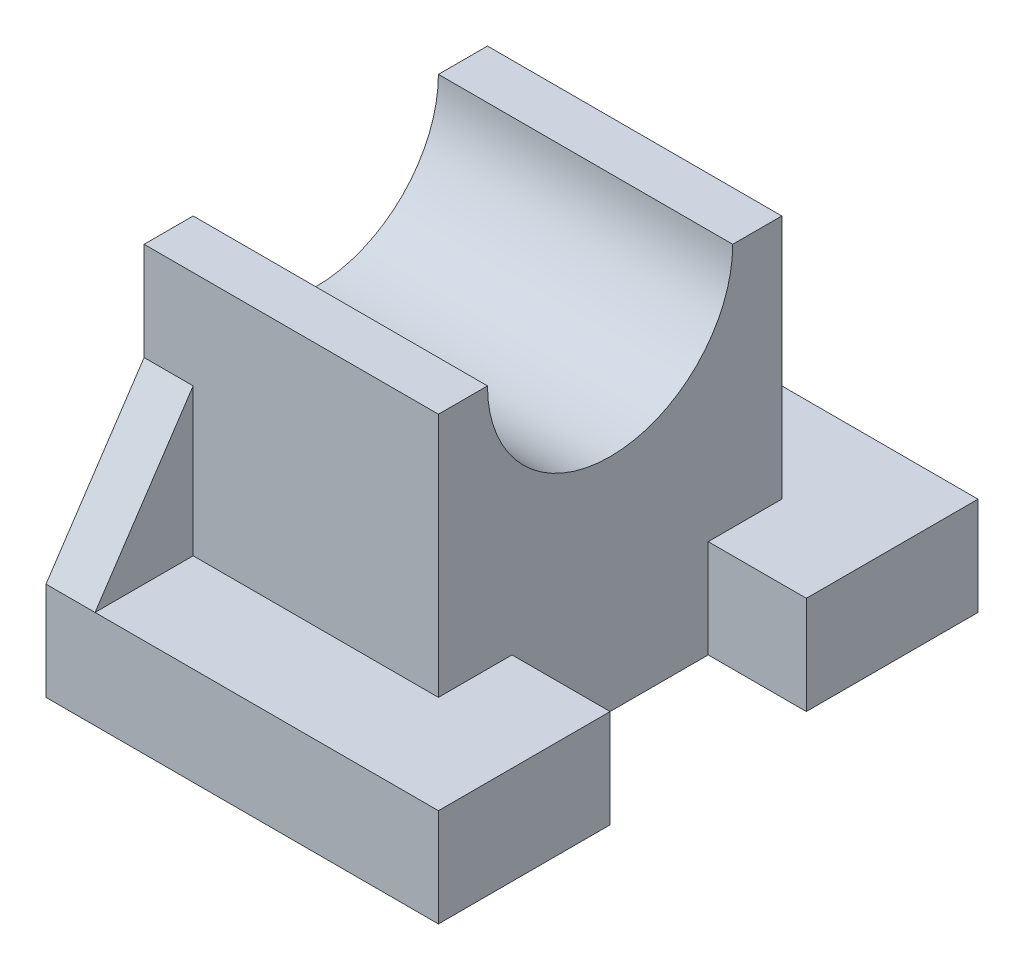
ISO-10303-21;
HEADER;
FILE_DESCRIPTION(('STEP AP214'),'2;1');
FILE_NAME('part.step','',(''),(''),'','','');
FILE_SCHEMA(('AUTOMOTIVE_DESIGN { 1 0 10303 214 1 1 1 1 }'));
ENDSEC;
DATA;
#1=APPLICATION_CONTEXT('core data for automotive mechanical design processes');
#2=APPLICATION_PROTOCOL_DEFINITION('international standard','automotive_design',2000,#1);
#3=PRODUCT_CONTEXT('',#1,'mechanical');
#4=PRODUCT('Part','Part','',(#3));
#5=PRODUCT_RELATED_PRODUCT_CATEGORY('part','',(#4));
#6=PRODUCT_DEFINITION_FORMATION('','',#4);
#7=PRODUCT_DEFINITION_CONTEXT('part definition',#1,'design');
#8=PRODUCT_DEFINITION('design','',#6,#7);
#9=PRODUCT_DEFINITION_SHAPE('','',#8);
#10=(LENGTH_UNIT() NAMED_UNIT(*) SI_UNIT(.MILLI.,.METRE.));
#11=(NAMED_UNIT(*) PLANE_ANGLE_UNIT() SI_UNIT($,.RADIAN.));
#12=(NAMED_UNIT(*) SI_UNIT($,.STERADIAN.) SOLID_ANGLE_UNIT());
#13=UNCERTAINTY_MEASURE_WITH_UNIT(LENGTH_MEASURE(1.E-05),#10,'distance_accuracy_value','');
#14=(GEOMETRIC_REPRESENTATION_CONTEXT(3) GLOBAL_UNCERTAINTY_ASSIGNED_CONTEXT((#13)) GLOBAL_UNIT_ASSIGNED_CONTEXT((#10,
#11,#12)) REPRESENTATION_CONTEXT('',''));
#15=CARTESIAN_POINT('',(0.,0.,0.));
#16=DIRECTION('',(0.,0.,1.));
#17=DIRECTION('',(1.,0.,0.));
#18=AXIS2_PLACEMENT_3D('',#15,#16,#17);
#19=CARTESIAN_POINT('',(0.,70.,0.));
#20=DIRECTION('',(0.,1.,0.));
#21=DIRECTION('',(0.,0.,1.));
#22=AXIS2_PLACEMENT_3D('',#19,#20,#21);
#23=PLANE('',#22);
#24=DIRECTION('',(1.,0.,0.));
#25=VECTOR('',#24,1.);
#26=CARTESIAN_POINT('',(-40.,70.,25.));
#27=LINE('',#26,#25);
#28=CARTESIAN_POINT('',(-40.,70.,25.));
#29=VERTEX_POINT('',#28);
#30=CARTESIAN_POINT('',(20.,70.,25.));
#31=VERTEX_POINT('',#30);
#32=EDGE_CURVE('E11',#29,#31,#27,.T.);
#33=ORIENTED_EDGE('',*,*,#32,.F.);
#34=DIRECTION('',(0.,0.,1.));
#35=VECTOR('',#34,1.);
#36=CARTESIAN_POINT('',(-40.,70.,-35.));
#37=LINE('',#36,#35);
#38=CARTESIAN_POINT('',(-40.,70.,35.));
#39=VERTEX_POINT('',#38);
#40=EDGE_CURVE('E171',#29,#39,#37,.T.);
#41=ORIENTED_EDGE('',*,*,#40,.T.);
#42=DIRECTION('',(1.,0.,0.));
#43=VECTOR('',#42,1.);
#44=CARTESIAN_POINT('',(-40.,70.,35.));
#45=LINE('',#44,#43);
#46=CARTESIAN_POINT('',(20.,70.,35.));
#47=VERTEX_POINT('',#46);
#48=EDGE_CURVE('E179',#39,#47,#45,.T.);
#49=ORIENTED_EDGE('',*,*,#48,.T.);
#50=DIRECTION('',(0.,0.,-1.));
#51=VECTOR('',#50,1.);
#52=CARTESIAN_POINT('',(20.,70.,-35.));
#53=LINE('',#52,#51);
#54=EDGE_CURVE('E305',#47,#31,#53,.T.);
#55=ORIENTED_EDGE('',*,*,#54,.T.);
#56=EDGE_LOOP('',(#33,#41,#49,#55));
#57=FACE_BOUND('',#56,.T.);
#58=ADVANCED_FACE('F39',(#57),#23,.T.);
#59=CARTESIAN_POINT('',(0.,20.,0.));
#60=DIRECTION('',(0.,-1.,0.));
#61=DIRECTION('',(0.,0.,-1.));
#62=AXIS2_PLACEMENT_3D('',#59,#60,#61);
#63=PLANE('',#62);
#64=DIRECTION('',(-1.,0.,0.));
#65=VECTOR('',#64,1.);
#66=CARTESIAN_POINT('',(0.,20.,-20.));
#67=LINE('',#66,#65);
#68=CARTESIAN_POINT('',(40.,20.,-20.));
#69=VERTEX_POINT('',#68);
#70=CARTESIAN_POINT('',(20.,20.,-20.));
#71=VERTEX_POINT('',#70);
#72=EDGE_CURVE('E295',#69,#71,#67,.T.);
#73=ORIENTED_EDGE('',*,*,#72,.F.);
#74=DIRECTION('',(0.,0.,-1.));
#75=VECTOR('',#74,1.);
#76=CARTESIAN_POINT('',(40.,20.,-55.));
#77=LINE('',#76,#75);
#78=CARTESIAN_POINT('',(40.,20.,-55.));
#79=VERTEX_POINT('',#78);
#80=EDGE_CURVE('E218',#69,#79,#77,.T.);
#81=ORIENTED_EDGE('',*,*,#80,.T.);
#82=DIRECTION('',(-1.,0.,0.));
#83=VECTOR('',#82,1.);
#84=CARTESIAN_POINT('',(40.,20.,-55.));
#85=LINE('',#84,#83);
#86=CARTESIAN_POINT('',(-30.,20.,-55.));
#87=VERTEX_POINT('',#86);
#88=EDGE_CURVE('E224',#79,#87,#85,.T.);
#89=ORIENTED_EDGE('',*,*,#88,.T.);
#90=DIRECTION('',(0.,0.,-1.));
#91=VECTOR('',#90,1.);
#92=CARTESIAN_POINT('',(-30.,20.,0.));
#93=LINE('',#92,#91);
#94=CARTESIAN_POINT('',(-30.,20.,-35.));
#95=VERTEX_POINT('',#94);
#96=EDGE_CURVE('E282',#95,#87,#93,.T.);
#97=ORIENTED_EDGE('',*,*,#96,.F.);
#98=DIRECTION('',(-1.,0.,0.));
#99=VECTOR('',#98,1.);
#100=CARTESIAN_POINT('',(0.,20.,-35.));
#101=LINE('',#100,#99);
#102=CARTESIAN_POINT('',(20.,20.,-35.));
#103=VERTEX_POINT('',#102);
#104=EDGE_CURVE('E205',#103,#95,#101,.T.);
#105=ORIENTED_EDGE('',*,*,#104,.F.);
#106=DIRECTION('',(0.,0.,-1.));
#107=VECTOR('',#106,1.);
#108=CARTESIAN_POINT('',(20.,20.,0.));
#109=LINE('',#108,#107);
#110=EDGE_CURVE('E209',#71,#103,#109,.T.);
#111=ORIENTED_EDGE('',*,*,#110,.F.);
#112=EDGE_LOOP('',(#73,#81,#89,#97,#105,#111));
#113=FACE_BOUND('',#112,.T.);
#114=ADVANCED_FACE('F372',(#113),#63,.F.);
#115=DIRECTION('',(1.,0.,0.));
#116=VECTOR('',#115,1.);
#117=CARTESIAN_POINT('',(0.,20.,20.));
#118=LINE('',#117,#116);
#119=CARTESIAN_POINT('',(20.,20.,20.));
#120=VERTEX_POINT('',#119);
#121=CARTESIAN_POINT('',(40.,20.,20.));
#122=VERTEX_POINT('',#121);
#123=EDGE_CURVE('E293',#120,#122,#118,.T.);
#124=ORIENTED_EDGE('',*,*,#123,.F.);
#125=CARTESIAN_POINT('',(20.,20.,35.));
#126=VERTEX_POINT('',#125);
#127=EDGE_CURVE('E210',#126,#120,#109,.T.);
#128=ORIENTED_EDGE('',*,*,#127,.F.);
#129=DIRECTION('',(1.,0.,0.));
#130=VECTOR('',#129,1.);
#131=CARTESIAN_POINT('',(0.,20.,35.));
#132=LINE('',#131,#130);
#133=CARTESIAN_POINT('',(-30.,20.,35.));
#134=VERTEX_POINT('',#133);
#135=EDGE_CURVE('E202',#134,#126,#132,.T.);
#136=ORIENTED_EDGE('',*,*,#135,.F.);
#137=CARTESIAN_POINT('',(-30.,20.,55.));
#138=VERTEX_POINT('',#137);
#139=EDGE_CURVE('E268',#138,#134,#93,.T.);
#140=ORIENTED_EDGE('',*,*,#139,.F.);
#141=DIRECTION('',(1.,0.,0.));
#142=VECTOR('',#141,1.);
#143=CARTESIAN_POINT('',(40.,20.,55.));
#144=LINE('',#143,#142);
#145=CARTESIAN_POINT('',(40.,20.,55.));
#146=VERTEX_POINT('',#145);
#147=EDGE_CURVE('E215',#138,#146,#144,.T.);
#148=ORIENTED_EDGE('',*,*,#147,.T.);
#149=EDGE_CURVE('E220',#146,#122,#77,.T.);
#150=ORIENTED_EDGE('',*,*,#149,.T.);
#151=EDGE_LOOP('',(#124,#128,#136,#140,#148,#150));
#152=FACE_BOUND('',#151,.T.);
#153=ADVANCED_FACE('F275',(#152),#63,.F.);
#154=CARTESIAN_POINT('',(40.,20.,-55.));
#155=DIRECTION('',(-1.,0.,0.));
#156=DIRECTION('',(0.,0.,1.));
#157=AXIS2_PLACEMENT_3D('',#154,#155,#156);
#158=PLANE('',#157);
#159=DIRECTION('',(0.,-1.,0.));
#160=VECTOR('',#159,1.);
#161=CARTESIAN_POINT('',(40.,70.,-20.));
#162=LINE('',#161,#160);
#163=CARTESIAN_POINT('',(40.,0.,-20.));
#164=VERTEX_POINT('',#163);
#165=EDGE_CURVE('E296',#69,#164,#162,.T.);
#166=ORIENTED_EDGE('',*,*,#165,.T.);
#167=DIRECTION('',(0.,0.,-1.));
#168=VECTOR('',#167,1.);
#169=CARTESIAN_POINT('',(40.,0.,-55.));
#170=LINE('',#169,#168);
#171=CARTESIAN_POINT('',(40.,0.,-55.));
#172=VERTEX_POINT('',#171);
#173=EDGE_CURVE('E234',#164,#172,#170,.T.);
#174=ORIENTED_EDGE('',*,*,#173,.T.);
#175=DIRECTION('',(0.,-1.,0.));
#176=VECTOR('',#175,1.);
#177=CARTESIAN_POINT('',(40.,20.,-55.));
#178=LINE('',#177,#176);
#179=EDGE_CURVE('E244',#79,#172,#178,.T.);
#180=ORIENTED_EDGE('',*,*,#179,.F.);
#181=ORIENTED_EDGE('',*,*,#80,.F.);
#182=EDGE_LOOP('',(#166,#174,#180,#181));
#183=FACE_BOUND('',#182,.T.);
#184=ADVANCED_FACE('F385',(#183),#158,.F.);
#185=DIRECTION('',(0.,-1.,0.));
#186=VECTOR('',#185,1.);
#187=CARTESIAN_POINT('',(40.,70.,20.));
#188=LINE('',#187,#186);
#189=CARTESIAN_POINT('',(40.,0.,20.));
#190=VERTEX_POINT('',#189);
#191=EDGE_CURVE('E62',#122,#190,#188,.T.);
#192=ORIENTED_EDGE('',*,*,#191,.F.);
#193=ORIENTED_EDGE('',*,*,#149,.F.);
#194=DIRECTION('',(0.,-1.,0.));
#195=VECTOR('',#194,1.);
#196=CARTESIAN_POINT('',(40.,20.,55.));
#197=LINE('',#196,#195);
#198=CARTESIAN_POINT('',(40.,0.,55.));
#199=VERTEX_POINT('',#198);
#200=EDGE_CURVE('E248',#146,#199,#197,.T.);
#201=ORIENTED_EDGE('',*,*,#200,.T.);
#202=EDGE_CURVE('E235',#199,#190,#170,.T.);
#203=ORIENTED_EDGE('',*,*,#202,.T.);
#204=EDGE_LOOP('',(#192,#193,#201,#203));
#205=FACE_BOUND('',#204,.T.);
#206=ADVANCED_FACE('F292',(#205),#158,.F.);
#207=CARTESIAN_POINT('',(0.,0.,0.));
#208=DIRECTION('',(0.,-1.,0.));
#209=DIRECTION('',(0.,0.,-1.));
#210=AXIS2_PLACEMENT_3D('',#207,#208,#209);
#211=PLANE('',#210);
#212=ORIENTED_EDGE('',*,*,#173,.F.);
#213=DIRECTION('',(-1.,0.,0.));
#214=VECTOR('',#213,1.);
#215=CARTESIAN_POINT('',(20.,0.,-20.));
#216=LINE('',#215,#214);
#217=CARTESIAN_POINT('',(20.,0.,-20.));
#218=VERTEX_POINT('',#217);
#219=EDGE_CURVE('E330',#164,#218,#216,.T.);
#220=ORIENTED_EDGE('',*,*,#219,.T.);
#221=DIRECTION('',(0.,0.,1.));
#222=VECTOR('',#221,1.);
#223=CARTESIAN_POINT('',(20.,0.,-20.));
#224=LINE('',#223,#222);
#225=CARTESIAN_POINT('',(20.,0.,20.));
#226=VERTEX_POINT('',#225);
#227=EDGE_CURVE('E334',#218,#226,#224,.T.);
#228=ORIENTED_EDGE('',*,*,#227,.T.);
#229=DIRECTION('',(1.,0.,0.));
#230=VECTOR('',#229,1.);
#231=CARTESIAN_POINT('',(20.,0.,20.));
#232=LINE('',#231,#230);
#233=EDGE_CURVE('E338',#226,#190,#232,.T.);
#234=ORIENTED_EDGE('',*,*,#233,.T.);
#235=ORIENTED_EDGE('',*,*,#202,.F.);
#236=DIRECTION('',(1.,0.,0.));
#237=VECTOR('',#236,1.);
#238=CARTESIAN_POINT('',(40.,0.,55.));
#239=LINE('',#238,#237);
#240=CARTESIAN_POINT('',(-40.,0.,55.));
#241=VERTEX_POINT('',#240);
#242=EDGE_CURVE('E231',#241,#199,#239,.T.);
#243=ORIENTED_EDGE('',*,*,#242,.F.);
#244=DIRECTION('',(0.,0.,1.));
#245=VECTOR('',#244,1.);
#246=CARTESIAN_POINT('',(-40.,0.,-55.));
#247=LINE('',#246,#245);
#248=CARTESIAN_POINT('',(-40.,0.,-55.));
#249=VERTEX_POINT('',#248);
#250=EDGE_CURVE('E214',#249,#241,#247,.T.);
#251=ORIENTED_EDGE('',*,*,#250,.F.);
#252=DIRECTION('',(-1.,0.,0.));
#253=VECTOR('',#252,1.);
#254=CARTESIAN_POINT('',(40.,0.,-55.));
#255=LINE('',#254,#253);
#256=EDGE_CURVE('E219',#172,#249,#255,.T.);
#257=ORIENTED_EDGE('',*,*,#256,.F.);
#258=EDGE_LOOP('',(#212,#220,#228,#234,#235,#243,#251,#257));
#259=FACE_BOUND('',#258,.T.);
#260=ADVANCED_FACE('F395',(#259),#211,.T.);
#261=CARTESIAN_POINT('',(-40.,70.,-35.));
#262=DIRECTION('',(0.,0.,1.));
#263=DIRECTION('',(1.,0.,0.));
#264=AXIS2_PLACEMENT_3D('',#261,#262,#263);
#265=PLANE('',#264);
#266=DIRECTION('',(0.,-1.,0.));
#267=VECTOR('',#266,1.);
#268=CARTESIAN_POINT('',(-30.,70.,-35.));
#269=LINE('',#268,#267);
#270=CARTESIAN_POINT('',(-30.,50.,-35.));
#271=VERTEX_POINT('',#270);
#272=EDGE_CURVE('E279',#271,#95,#269,.T.);
#273=ORIENTED_EDGE('',*,*,#272,.F.);
#274=DIRECTION('',(-1.,0.,0.));
#275=VECTOR('',#274,1.);
#276=CARTESIAN_POINT('',(-40.,50.,-35.));
#277=LINE('',#276,#275);
#278=CARTESIAN_POINT('',(-40.,50.,-35.));
#279=VERTEX_POINT('',#278);
#280=EDGE_CURVE('E280',#271,#279,#277,.T.);
#281=ORIENTED_EDGE('',*,*,#280,.T.);
#282=DIRECTION('',(0.,-1.,0.));
#283=VECTOR('',#282,1.);
#284=CARTESIAN_POINT('',(-40.,70.,-35.));
#285=LINE('',#284,#283);
#286=CARTESIAN_POINT('',(-40.,70.,-35.));
#287=VERTEX_POINT('',#286);
#288=EDGE_CURVE('E195',#287,#279,#285,.T.);
#289=ORIENTED_EDGE('',*,*,#288,.F.);
#290=DIRECTION('',(-1.,0.,0.));
#291=VECTOR('',#290,1.);
#292=CARTESIAN_POINT('',(-40.,70.,-35.));
#293=LINE('',#292,#291);
#294=CARTESIAN_POINT('',(20.,70.,-35.));
#295=VERTEX_POINT('',#294);
#296=EDGE_CURVE('E176',#295,#287,#293,.T.);
#297=ORIENTED_EDGE('',*,*,#296,.F.);
#298=DIRECTION('',(0.,-1.,0.));
#299=VECTOR('',#298,1.);
#300=CARTESIAN_POINT('',(20.,70.,-35.));
#301=LINE('',#300,#299);
#302=EDGE_CURVE('E198',#295,#103,#301,.T.);
#303=ORIENTED_EDGE('',*,*,#302,.T.);
#304=ORIENTED_EDGE('',*,*,#104,.T.);
#305=EDGE_LOOP('',(#273,#281,#289,#297,#303,#304));
#306=FACE_BOUND('',#305,.T.);
#307=ADVANCED_FACE('F376',(#306),#265,.F.);
#308=CARTESIAN_POINT('',(-40.,70.,35.));
#309=DIRECTION('',(0.,0.,-1.));
#310=DIRECTION('',(-1.,0.,0.));
#311=AXIS2_PLACEMENT_3D('',#308,#309,#310);
#312=PLANE('',#311);
#313=DIRECTION('',(1.,0.,0.));
#314=VECTOR('',#313,1.);
#315=CARTESIAN_POINT('',(-40.,50.,35.));
#316=LINE('',#315,#314);
#317=CARTESIAN_POINT('',(-40.,50.,35.));
#318=VERTEX_POINT('',#317);
#319=CARTESIAN_POINT('',(-30.,50.,35.));
#320=VERTEX_POINT('',#319);
#321=EDGE_CURVE('E255',#318,#320,#316,.T.);
#322=ORIENTED_EDGE('',*,*,#321,.T.);
#323=DIRECTION('',(0.,1.,0.));
#324=VECTOR('',#323,1.);
#325=CARTESIAN_POINT('',(-30.,70.,35.));
#326=LINE('',#325,#324);
#327=EDGE_CURVE('E259',#134,#320,#326,.T.);
#328=ORIENTED_EDGE('',*,*,#327,.F.);
#329=ORIENTED_EDGE('',*,*,#135,.T.);
#330=DIRECTION('',(0.,-1.,0.));
#331=VECTOR('',#330,1.);
#332=CARTESIAN_POINT('',(20.,70.,35.));
#333=LINE('',#332,#331);
#334=EDGE_CURVE('E183',#47,#126,#333,.T.);
#335=ORIENTED_EDGE('',*,*,#334,.F.);
#336=ORIENTED_EDGE('',*,*,#48,.F.);
#337=DIRECTION('',(0.,-1.,0.));
#338=VECTOR('',#337,1.);
#339=CARTESIAN_POINT('',(-40.,70.,35.));
#340=LINE('',#339,#338);
#341=EDGE_CURVE('E191',#39,#318,#340,.T.);
#342=ORIENTED_EDGE('',*,*,#341,.T.);
#343=EDGE_LOOP('',(#322,#328,#329,#335,#336,#342));
#344=FACE_BOUND('',#343,.T.);
#345=ADVANCED_FACE('F308',(#344),#312,.F.);
#346=CARTESIAN_POINT('',(-40.,20.,-55.));
#347=DIRECTION('',(1.,0.,0.));
#348=DIRECTION('',(0.,0.,-1.));
#349=AXIS2_PLACEMENT_3D('',#346,#347,#348);
#350=PLANE('',#349);
#351=ORIENTED_EDGE('',*,*,#40,.F.);
#352=CARTESIAN_POINT('',(-40.,70.,0.));
#353=DIRECTION('',(1.,0.,0.));
#354=DIRECTION('',(0.,0.,-1.));
#355=AXIS2_PLACEMENT_3D('',#352,#353,#354);
#356=CIRCLE('',#355,25.);
#357=CARTESIAN_POINT('',(-40.,70.,-25.));
#358=VERTEX_POINT('',#357);
#359=EDGE_CURVE('E158',#29,#358,#356,.T.);
#360=ORIENTED_EDGE('',*,*,#359,.T.);
#361=EDGE_CURVE('E169',#287,#358,#37,.T.);
#362=ORIENTED_EDGE('',*,*,#361,.F.);
#363=ORIENTED_EDGE('',*,*,#288,.T.);
#364=DIRECTION('',(0.,-0.832050294337844,-0.554700196225229));
#365=VECTOR('',#364,1.);
#366=CARTESIAN_POINT('',(-40.,20.,-55.));
#367=LINE('',#366,#365);
#368=CARTESIAN_POINT('',(-40.,20.,-55.));
#369=VERTEX_POINT('',#368);
#370=EDGE_CURVE('E320',#279,#369,#367,.T.);
#371=ORIENTED_EDGE('',*,*,#370,.T.);
#372=DIRECTION('',(0.,-1.,0.));
#373=VECTOR('',#372,1.);
#374=CARTESIAN_POINT('',(-40.,20.,-55.));
#375=LINE('',#374,#373);
#376=EDGE_CURVE('E227',#369,#249,#375,.T.);
#377=ORIENTED_EDGE('',*,*,#376,.T.);
#378=ORIENTED_EDGE('',*,*,#250,.T.);
#379=DIRECTION('',(0.,-1.,0.));
#380=VECTOR('',#379,1.);
#381=CARTESIAN_POINT('',(-40.,20.,55.));
#382=LINE('',#381,#380);
#383=CARTESIAN_POINT('',(-40.,20.,55.));
#384=VERTEX_POINT('',#383);
#385=EDGE_CURVE('E252',#384,#241,#382,.T.);
#386=ORIENTED_EDGE('',*,*,#385,.F.);
#387=DIRECTION('',(0.,0.832050294337844,-0.554700196225229));
#388=VECTOR('',#387,1.);
#389=CARTESIAN_POINT('',(-40.,20.,55.));
#390=LINE('',#389,#388);
#391=EDGE_CURVE('E311',#384,#318,#390,.T.);
#392=ORIENTED_EDGE('',*,*,#391,.T.);
#393=ORIENTED_EDGE('',*,*,#341,.F.);
#394=EDGE_LOOP('',(#351,#360,#362,#363,#371,#377,#378,#386,#392,#393));
#395=FACE_BOUND('',#394,.T.);
#396=ADVANCED_FACE('F41',(#395),#350,.F.);
#397=CARTESIAN_POINT('',(40.,20.,55.));
#398=DIRECTION('',(0.,0.,-1.));
#399=DIRECTION('',(-1.,0.,0.));
#400=AXIS2_PLACEMENT_3D('',#397,#398,#399);
#401=PLANE('',#400);
#402=ORIENTED_EDGE('',*,*,#147,.F.);
#403=DIRECTION('',(1.,0.,0.));
#404=VECTOR('',#403,1.);
#405=CARTESIAN_POINT('',(-40.,20.,55.));
#406=LINE('',#405,#404);
#407=EDGE_CURVE('E286',#384,#138,#406,.T.);
#408=ORIENTED_EDGE('',*,*,#407,.F.);
#409=ORIENTED_EDGE('',*,*,#385,.T.);
#410=ORIENTED_EDGE('',*,*,#242,.T.);
#411=ORIENTED_EDGE('',*,*,#200,.F.);
#412=EDGE_LOOP('',(#402,#408,#409,#410,#411));
#413=FACE_BOUND('',#412,.T.);
#414=ADVANCED_FACE('F285',(#413),#401,.F.);
#415=CARTESIAN_POINT('',(40.,20.,-55.));
#416=DIRECTION('',(0.,0.,1.));
#417=DIRECTION('',(1.,0.,0.));
#418=AXIS2_PLACEMENT_3D('',#415,#416,#417);
#419=PLANE('',#418);
#420=ORIENTED_EDGE('',*,*,#376,.F.);
#421=DIRECTION('',(1.,0.,0.));
#422=VECTOR('',#421,1.);
#423=CARTESIAN_POINT('',(-40.,20.,-55.));
#424=LINE('',#423,#422);
#425=EDGE_CURVE('E313',#369,#87,#424,.T.);
#426=ORIENTED_EDGE('',*,*,#425,.T.);
#427=ORIENTED_EDGE('',*,*,#88,.F.);
#428=ORIENTED_EDGE('',*,*,#179,.T.);
#429=ORIENTED_EDGE('',*,*,#256,.T.);
#430=EDGE_LOOP('',(#420,#426,#427,#428,#429));
#431=FACE_BOUND('',#430,.T.);
#432=ADVANCED_FACE('F390',(#431),#419,.F.);
#433=CARTESIAN_POINT('',(20.,70.,-35.));
#434=DIRECTION('',(-1.,0.,0.));
#435=DIRECTION('',(0.,0.,1.));
#436=AXIS2_PLACEMENT_3D('',#433,#434,#435);
#437=PLANE('',#436);
#438=CARTESIAN_POINT('',(20.,70.,-25.));
#439=VERTEX_POINT('',#438);
#440=EDGE_CURVE('E358',#439,#295,#53,.T.);
#441=ORIENTED_EDGE('',*,*,#440,.F.);
#442=CARTESIAN_POINT('',(20.,70.,0.));
#443=DIRECTION('',(-1.,0.,0.));
#444=DIRECTION('',(0.,0.,1.));
#445=AXIS2_PLACEMENT_3D('',#442,#443,#444);
#446=CIRCLE('',#445,25.);
#447=EDGE_CURVE('E54',#439,#31,#446,.T.);
#448=ORIENTED_EDGE('',*,*,#447,.T.);
#449=ORIENTED_EDGE('',*,*,#54,.F.);
#450=ORIENTED_EDGE('',*,*,#334,.T.);
#451=ORIENTED_EDGE('',*,*,#127,.T.);
#452=DIRECTION('',(0.,-1.,0.));
#453=VECTOR('',#452,1.);
#454=CARTESIAN_POINT('',(20.,70.,20.));
#455=LINE('',#454,#453);
#456=EDGE_CURVE('E301',#120,#226,#455,.T.);
#457=ORIENTED_EDGE('',*,*,#456,.T.);
#458=ORIENTED_EDGE('',*,*,#227,.F.);
#459=DIRECTION('',(0.,-1.,0.));
#460=VECTOR('',#459,1.);
#461=CARTESIAN_POINT('',(20.,70.,-20.));
#462=LINE('',#461,#460);
#463=EDGE_CURVE('E345',#71,#218,#462,.T.);
#464=ORIENTED_EDGE('',*,*,#463,.F.);
#465=ORIENTED_EDGE('',*,*,#110,.T.);
#466=ORIENTED_EDGE('',*,*,#302,.F.);
#467=EDGE_LOOP('',(#441,#448,#449,#450,#451,#457,#458,#464,#465,#466));
#468=FACE_BOUND('',#467,.T.);
#469=ADVANCED_FACE('F299',(#468),#437,.F.);
#470=DIRECTION('',(1.,0.,0.));
#471=VECTOR('',#470,1.);
#472=CARTESIAN_POINT('',(-40.,70.,-25.));
#473=LINE('',#472,#471);
#474=EDGE_CURVE('E48',#439,#358,#473,.F.);
#475=ORIENTED_EDGE('',*,*,#474,.F.);
#476=ORIENTED_EDGE('',*,*,#440,.T.);
#477=ORIENTED_EDGE('',*,*,#296,.T.);
#478=ORIENTED_EDGE('',*,*,#361,.T.);
#479=EDGE_LOOP('',(#475,#476,#477,#478));
#480=FACE_BOUND('',#479,.T.);
#481=ADVANCED_FACE('F174',(#480),#23,.T.);
#482=CARTESIAN_POINT('',(-30.,50.,-55.));
#483=DIRECTION('',(-1.,0.,0.));
#484=DIRECTION('',(0.,0.,1.));
#485=AXIS2_PLACEMENT_3D('',#482,#483,#484);
#486=PLANE('',#485);
#487=ORIENTED_EDGE('',*,*,#327,.T.);
#488=DIRECTION('',(0.,-0.832050294337844,0.554700196225229));
#489=VECTOR('',#488,1.);
#490=CARTESIAN_POINT('',(-30.,91.5384615384615,7.30769230769231));
#491=LINE('',#490,#489);
#492=EDGE_CURVE('E164',#320,#138,#491,.T.);
#493=ORIENTED_EDGE('',*,*,#492,.T.);
#494=ORIENTED_EDGE('',*,*,#139,.T.);
#495=EDGE_LOOP('',(#487,#493,#494));
#496=FACE_BOUND('',#495,.T.);
#497=ADVANCED_FACE('F267',(#496),#486,.F.);
#498=ORIENTED_EDGE('',*,*,#96,.T.);
#499=DIRECTION('',(0.,0.832050294337844,0.554700196225229));
#500=VECTOR('',#499,1.);
#501=CARTESIAN_POINT('',(-30.,40.7692307692308,-41.1538461538462));
#502=LINE('',#501,#500);
#503=EDGE_CURVE('E317',#87,#271,#502,.T.);
#504=ORIENTED_EDGE('',*,*,#503,.T.);
#505=ORIENTED_EDGE('',*,*,#272,.T.);
#506=EDGE_LOOP('',(#498,#504,#505));
#507=FACE_BOUND('',#506,.T.);
#508=ADVANCED_FACE('F366',(#507),#486,.F.);
#509=CARTESIAN_POINT('',(20.,70.,-20.));
#510=DIRECTION('',(0.,0.,1.));
#511=DIRECTION('',(1.,0.,0.));
#512=AXIS2_PLACEMENT_3D('',#509,#510,#511);
#513=PLANE('',#512);
#514=ORIENTED_EDGE('',*,*,#72,.T.);
#515=ORIENTED_EDGE('',*,*,#463,.T.);
#516=ORIENTED_EDGE('',*,*,#219,.F.);
#517=ORIENTED_EDGE('',*,*,#165,.F.);
#518=EDGE_LOOP('',(#514,#515,#516,#517));
#519=FACE_BOUND('',#518,.T.);
#520=ADVANCED_FACE('F398',(#519),#513,.T.);
#521=CARTESIAN_POINT('',(20.,70.,20.));
#522=DIRECTION('',(0.,0.,-1.));
#523=DIRECTION('',(-1.,0.,0.));
#524=AXIS2_PLACEMENT_3D('',#521,#522,#523);
#525=PLANE('',#524);
#526=ORIENTED_EDGE('',*,*,#123,.T.);
#527=ORIENTED_EDGE('',*,*,#191,.T.);
#528=ORIENTED_EDGE('',*,*,#233,.F.);
#529=ORIENTED_EDGE('',*,*,#456,.F.);
#530=EDGE_LOOP('',(#526,#527,#528,#529));
#531=FACE_BOUND('',#530,.T.);
#532=ADVANCED_FACE('F396',(#531),#525,.T.);
#533=CARTESIAN_POINT('',(-40.,20.,-55.));
#534=DIRECTION('',(0.,-0.554700196225229,0.832050294337844));
#535=DIRECTION('',(0.,-0.832050294337844,-0.554700196225229));
#536=AXIS2_PLACEMENT_3D('',#533,#534,#535);
#537=PLANE('',#536);
#538=ORIENTED_EDGE('',*,*,#425,.F.);
#539=ORIENTED_EDGE('',*,*,#370,.F.);
#540=ORIENTED_EDGE('',*,*,#280,.F.);
#541=ORIENTED_EDGE('',*,*,#503,.F.);
#542=EDGE_LOOP('',(#538,#539,#540,#541));
#543=FACE_BOUND('',#542,.T.);
#544=ADVANCED_FACE('F392',(#543),#537,.F.);
#545=CARTESIAN_POINT('',(-40.,20.,55.));
#546=DIRECTION('',(0.,-0.554700196225229,-0.832050294337844));
#547=DIRECTION('',(0.,0.832050294337844,-0.554700196225229));
#548=AXIS2_PLACEMENT_3D('',#545,#546,#547);
#549=PLANE('',#548);
#550=ORIENTED_EDGE('',*,*,#321,.F.);
#551=ORIENTED_EDGE('',*,*,#391,.F.);
#552=ORIENTED_EDGE('',*,*,#407,.T.);
#553=ORIENTED_EDGE('',*,*,#492,.F.);
#554=EDGE_LOOP('',(#550,#551,#552,#553));
#555=FACE_BOUND('',#554,.T.);
#556=ADVANCED_FACE('F310',(#555),#549,.F.);
#557=CARTESIAN_POINT('',(-40.,70.,0.));
#558=DIRECTION('',(1.,0.,0.));
#559=DIRECTION('',(0.,0.,-1.));
#560=AXIS2_PLACEMENT_3D('',#557,#558,#559);
#561=CYLINDRICAL_SURFACE('',#560,25.);
#562=ORIENTED_EDGE('',*,*,#32,.T.);
#563=ORIENTED_EDGE('',*,*,#447,.F.);
#564=ORIENTED_EDGE('',*,*,#474,.T.);
#565=ORIENTED_EDGE('',*,*,#359,.F.);
#566=EDGE_LOOP('',(#562,#563,#564,#565));
#567=FACE_BOUND('',#566,.T.);
#568=ADVANCED_FACE('F157',(#567),#561,.F.);
#569=CLOSED_SHELL('',(#58,#114,#153,#184,#206,#260,#307,#345,#396,#414,#432,#469,#481,#497,#508,
#520,#532,#544,#556,#568));
#570=MANIFOLD_SOLID_BREP('B2',#569);
#571=ADVANCED_BREP_SHAPE_REPRESENTATION('',(#18,#570),#14);
#572=SHAPE_DEFINITION_REPRESENTATION(#9,#571);
ENDSEC;
END-ISO-10303-21;
